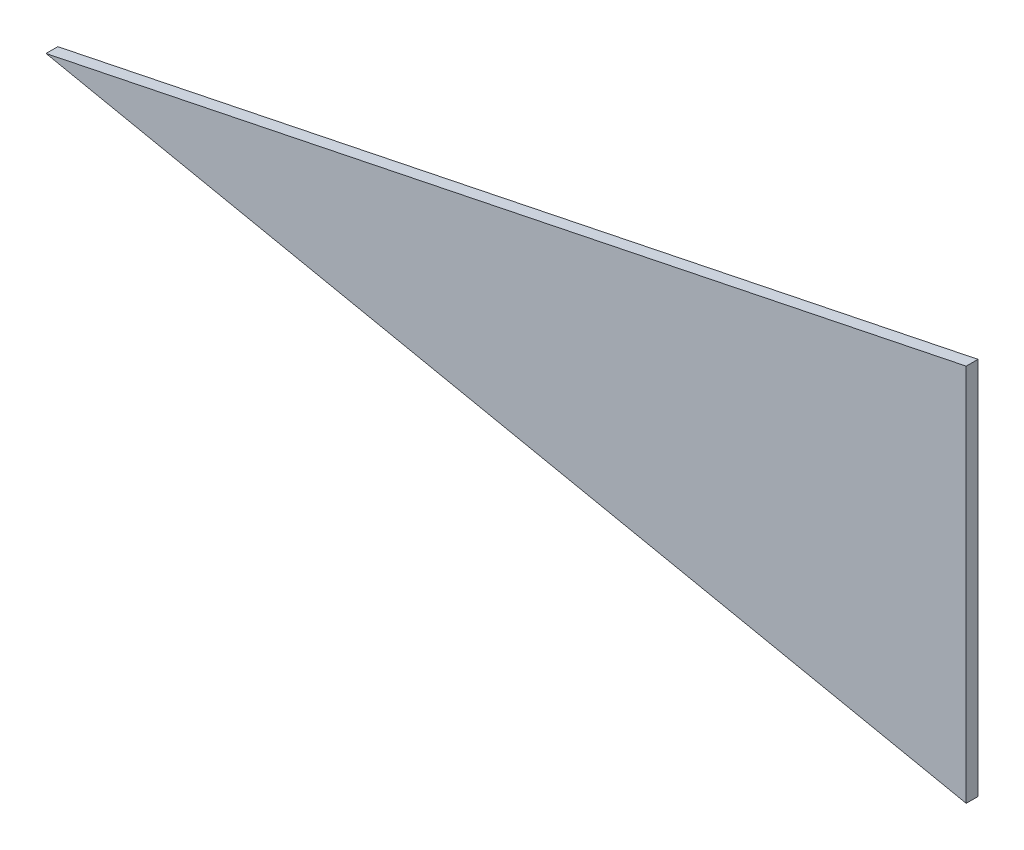
ISO-10303-21;
HEADER;
FILE_DESCRIPTION(('STEP AP214'),'2;1');
FILE_NAME('part.step','',(''),(''),'','','');
FILE_SCHEMA(('AUTOMOTIVE_DESIGN { 1 0 10303 214 1 1 1 1 }'));
ENDSEC;
DATA;
#1=APPLICATION_CONTEXT('core data for automotive mechanical design processes');
#2=APPLICATION_PROTOCOL_DEFINITION('international standard','automotive_design',2000,#1);
#3=PRODUCT_CONTEXT('',#1,'mechanical');
#4=PRODUCT('Part','Part','',(#3));
#5=PRODUCT_RELATED_PRODUCT_CATEGORY('part','',(#4));
#6=PRODUCT_DEFINITION_FORMATION('','',#4);
#7=PRODUCT_DEFINITION_CONTEXT('part definition',#1,'design');
#8=PRODUCT_DEFINITION('design','',#6,#7);
#9=PRODUCT_DEFINITION_SHAPE('','',#8);
#10=(LENGTH_UNIT() NAMED_UNIT(*) SI_UNIT(.MILLI.,.METRE.));
#11=(NAMED_UNIT(*) PLANE_ANGLE_UNIT() SI_UNIT($,.RADIAN.));
#12=(NAMED_UNIT(*) SI_UNIT($,.STERADIAN.) SOLID_ANGLE_UNIT());
#13=UNCERTAINTY_MEASURE_WITH_UNIT(LENGTH_MEASURE(1.E-05),#10,'distance_accuracy_value','');
#14=(GEOMETRIC_REPRESENTATION_CONTEXT(3) GLOBAL_UNCERTAINTY_ASSIGNED_CONTEXT((#13)) GLOBAL_UNIT_ASSIGNED_CONTEXT((#10,
#11,#12)) REPRESENTATION_CONTEXT('',''));
#15=CARTESIAN_POINT('',(0.,0.,0.));
#16=DIRECTION('',(0.,0.,1.));
#17=DIRECTION('',(1.,0.,0.));
#18=AXIS2_PLACEMENT_3D('',#15,#16,#17);
#19=CARTESIAN_POINT('',(-555.454822009768,-88.3268062912859,15.));
#20=DIRECTION('',(0.201520912547528,-0.97948421212698,0.));
#21=DIRECTION('',(0.97948421212698,0.201520912547528,0.));
#22=AXIS2_PLACEMENT_3D('',#19,#20,#21);
#23=PLANE('',#22);
#24=DIRECTION('',(-0.97948421212698,-0.201520912547528,0.));
#25=VECTOR('',#24,1.);
#26=CARTESIAN_POINT('',(-555.454822009768,-88.3268062912859,0.));
#27=LINE('',#26,#25);
#28=CARTESIAN_POINT('',(613.321633918343,152.1394463002,0.));
#29=VERTEX_POINT('',#28);
#30=CARTESIAN_POINT('',(-555.454822009768,-88.3268062912859,0.));
#31=VERTEX_POINT('',#30);
#32=EDGE_CURVE('E89',#29,#31,#27,.T.);
#33=ORIENTED_EDGE('',*,*,#32,.T.);
#34=DIRECTION('',(0.,0.,-1.));
#35=VECTOR('',#34,1.);
#36=CARTESIAN_POINT('',(-555.454822009768,-88.3268062912859,15.));
#37=LINE('',#36,#35);
#38=CARTESIAN_POINT('',(-555.454822009768,-88.3268062912859,15.));
#39=VERTEX_POINT('',#38);
#40=EDGE_CURVE('E11',#39,#31,#37,.T.);
#41=ORIENTED_EDGE('',*,*,#40,.F.);
#42=DIRECTION('',(-0.97948421212698,-0.201520912547528,0.));
#43=VECTOR('',#42,1.);
#44=CARTESIAN_POINT('',(-555.454822009768,-88.3268062912859,15.));
#45=LINE('',#44,#43);
#46=CARTESIAN_POINT('',(613.321633918343,152.1394463002,15.));
#47=VERTEX_POINT('',#46);
#48=EDGE_CURVE('E81',#47,#39,#45,.T.);
#49=ORIENTED_EDGE('',*,*,#48,.F.);
#50=DIRECTION('',(0.,0.,-1.));
#51=VECTOR('',#50,1.);
#52=CARTESIAN_POINT('',(613.321633918343,152.1394463002,15.));
#53=LINE('',#52,#51);
#54=EDGE_CURVE('E90',#47,#29,#53,.T.);
#55=ORIENTED_EDGE('',*,*,#54,.T.);
#56=EDGE_LOOP('',(#33,#41,#49,#55));
#57=FACE_BOUND('',#56,.T.);
#58=ADVANCED_FACE('F39',(#57),#23,.F.);
#59=CARTESIAN_POINT('',(-555.454822009768,-88.3268062912859,15.));
#60=DIRECTION('',(0.201520912547529,0.97948421212698,0.));
#61=DIRECTION('',(-0.97948421212698,0.201520912547529,0.));
#62=AXIS2_PLACEMENT_3D('',#59,#60,#61);
#63=PLANE('',#62);
#64=DIRECTION('',(0.97948421212698,-0.201520912547529,0.));
#65=VECTOR('',#64,1.);
#66=CARTESIAN_POINT('',(-555.454822009768,-88.3268062912859,0.));
#67=LINE('',#66,#65);
#68=CARTESIAN_POINT('',(613.321633918343,-328.793058882772,0.));
#69=VERTEX_POINT('',#68);
#70=EDGE_CURVE('E68',#31,#69,#67,.T.);
#71=ORIENTED_EDGE('',*,*,#70,.T.);
#72=DIRECTION('',(0.,0.,-1.));
#73=VECTOR('',#72,1.);
#74=CARTESIAN_POINT('',(613.321633918343,-328.793058882772,15.));
#75=LINE('',#74,#73);
#76=CARTESIAN_POINT('',(613.321633918343,-328.793058882772,15.));
#77=VERTEX_POINT('',#76);
#78=EDGE_CURVE('E48',#77,#69,#75,.T.);
#79=ORIENTED_EDGE('',*,*,#78,.F.);
#80=DIRECTION('',(0.97948421212698,-0.201520912547529,0.));
#81=VECTOR('',#80,1.);
#82=CARTESIAN_POINT('',(-555.454822009768,-88.3268062912859,15.));
#83=LINE('',#82,#81);
#84=EDGE_CURVE('E76',#39,#77,#83,.T.);
#85=ORIENTED_EDGE('',*,*,#84,.F.);
#86=ORIENTED_EDGE('',*,*,#40,.T.);
#87=EDGE_LOOP('',(#71,#79,#85,#86));
#88=FACE_BOUND('',#87,.T.);
#89=ADVANCED_FACE('F77',(#88),#63,.F.);
#90=CARTESIAN_POINT('',(613.321633918343,152.1394463002,15.));
#91=DIRECTION('',(-1.,0.,0.));
#92=DIRECTION('',(0.,0.,1.));
#93=AXIS2_PLACEMENT_3D('',#90,#91,#92);
#94=PLANE('',#93);
#95=DIRECTION('',(0.,1.,0.));
#96=VECTOR('',#95,1.);
#97=CARTESIAN_POINT('',(613.321633918343,152.1394463002,0.));
#98=LINE('',#97,#96);
#99=EDGE_CURVE('E73',#69,#29,#98,.T.);
#100=ORIENTED_EDGE('',*,*,#99,.T.);
#101=ORIENTED_EDGE('',*,*,#54,.F.);
#102=DIRECTION('',(0.,1.,0.));
#103=VECTOR('',#102,1.);
#104=CARTESIAN_POINT('',(613.321633918343,152.1394463002,15.));
#105=LINE('',#104,#103);
#106=EDGE_CURVE('E56',#77,#47,#105,.T.);
#107=ORIENTED_EDGE('',*,*,#106,.F.);
#108=ORIENTED_EDGE('',*,*,#78,.T.);
#109=EDGE_LOOP('',(#100,#101,#107,#108));
#110=FACE_BOUND('',#109,.T.);
#111=ADVANCED_FACE('F102',(#110),#94,.F.);
#112=CARTESIAN_POINT('',(0.,0.,15.));
#113=DIRECTION('',(0.,0.,-1.));
#114=DIRECTION('',(-1.,0.,0.));
#115=AXIS2_PLACEMENT_3D('',#112,#113,#114);
#116=PLANE('',#115);
#117=ORIENTED_EDGE('',*,*,#48,.T.);
#118=ORIENTED_EDGE('',*,*,#84,.T.);
#119=ORIENTED_EDGE('',*,*,#106,.T.);
#120=EDGE_LOOP('',(#117,#118,#119));
#121=FACE_BOUND('',#120,.T.);
#122=ADVANCED_FACE('F84',(#121),#116,.F.);
#123=CARTESIAN_POINT('',(0.,0.,0.));
#124=DIRECTION('',(0.,0.,-1.));
#125=DIRECTION('',(-1.,0.,0.));
#126=AXIS2_PLACEMENT_3D('',#123,#124,#125);
#127=PLANE('',#126);
#128=ORIENTED_EDGE('',*,*,#32,.F.);
#129=ORIENTED_EDGE('',*,*,#99,.F.);
#130=ORIENTED_EDGE('',*,*,#70,.F.);
#131=EDGE_LOOP('',(#128,#129,#130));
#132=FACE_BOUND('',#131,.T.);
#133=ADVANCED_FACE('F103',(#132),#127,.T.);
#134=CLOSED_SHELL('',(#58,#89,#111,#122,#133));
#135=MANIFOLD_SOLID_BREP('B2',#134);
#136=ADVANCED_BREP_SHAPE_REPRESENTATION('',(#18,#135),#14);
#137=SHAPE_DEFINITION_REPRESENTATION(#9,#136);
ENDSEC;
END-ISO-10303-21;
